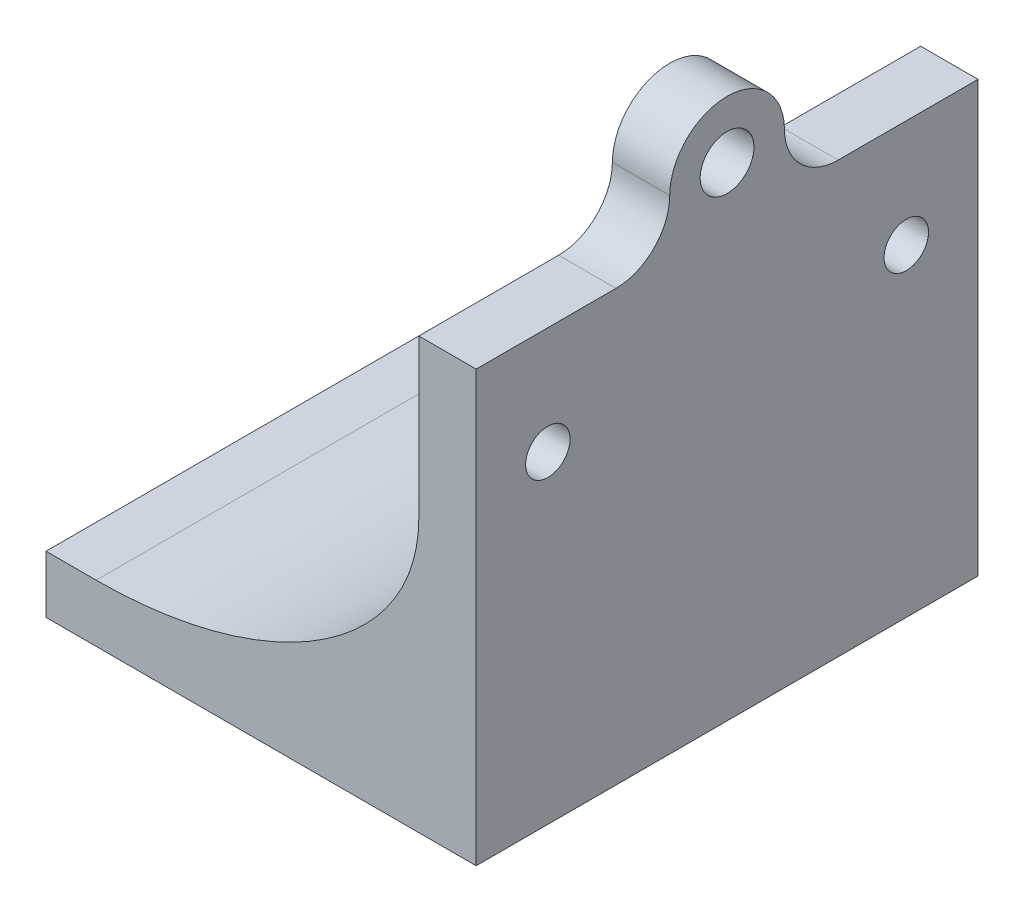
ISO-10303-21;
HEADER;
FILE_DESCRIPTION(('STEP AP214'),'2;1');
FILE_NAME('part.step','',(''),(''),'','','');
FILE_SCHEMA(('AUTOMOTIVE_DESIGN { 1 0 10303 214 1 1 1 1 }'));
ENDSEC;
DATA;
#1=APPLICATION_CONTEXT('core data for automotive mechanical design processes');
#2=APPLICATION_PROTOCOL_DEFINITION('international standard','automotive_design',2000,#1);
#3=PRODUCT_CONTEXT('',#1,'mechanical');
#4=PRODUCT('Part','Part','',(#3));
#5=PRODUCT_RELATED_PRODUCT_CATEGORY('part','',(#4));
#6=PRODUCT_DEFINITION_FORMATION('','',#4);
#7=PRODUCT_DEFINITION_CONTEXT('part definition',#1,'design');
#8=PRODUCT_DEFINITION('design','',#6,#7);
#9=PRODUCT_DEFINITION_SHAPE('','',#8);
#10=(LENGTH_UNIT() NAMED_UNIT(*) SI_UNIT(.MILLI.,.METRE.));
#11=(NAMED_UNIT(*) PLANE_ANGLE_UNIT() SI_UNIT($,.RADIAN.));
#12=(NAMED_UNIT(*) SI_UNIT($,.STERADIAN.) SOLID_ANGLE_UNIT());
#13=UNCERTAINTY_MEASURE_WITH_UNIT(LENGTH_MEASURE(1.E-05),#10,'distance_accuracy_value','');
#14=(GEOMETRIC_REPRESENTATION_CONTEXT(3) GLOBAL_UNCERTAINTY_ASSIGNED_CONTEXT((#13)) GLOBAL_UNIT_ASSIGNED_CONTEXT((#10,
#11,#12)) REPRESENTATION_CONTEXT('',''));
#15=CARTESIAN_POINT('',(0.,0.,0.));
#16=DIRECTION('',(0.,0.,1.));
#17=DIRECTION('',(1.,0.,0.));
#18=AXIS2_PLACEMENT_3D('',#15,#16,#17);
#19=CARTESIAN_POINT('',(0.,60.,70.));
#20=DIRECTION('',(0.,-1.,0.));
#21=DIRECTION('',(0.,0.,-1.));
#22=AXIS2_PLACEMENT_3D('',#19,#20,#21);
#23=PLANE('',#22);
#24=DIRECTION('',(1.,0.,0.));
#25=VECTOR('',#24,1.);
#26=CARTESIAN_POINT('',(-42.6361497533813,60.,19.500083727735));
#27=LINE('',#26,#25);
#28=CARTESIAN_POINT('',(-8.,60.,19.500083727735));
#29=VERTEX_POINT('',#28);
#30=CARTESIAN_POINT('',(0.,60.,19.500083727735));
#31=VERTEX_POINT('',#30);
#32=EDGE_CURVE('E66',#29,#31,#27,.T.);
#33=ORIENTED_EDGE('',*,*,#32,.T.);
#34=DIRECTION('',(0.,0.,-1.));
#35=VECTOR('',#34,1.);
#36=CARTESIAN_POINT('',(0.,60.,70.));
#37=LINE('',#36,#35);
#38=CARTESIAN_POINT('',(0.,60.,0.));
#39=VERTEX_POINT('',#38);
#40=EDGE_CURVE('E160',#31,#39,#37,.T.);
#41=ORIENTED_EDGE('',*,*,#40,.T.);
#42=DIRECTION('',(-1.,0.,0.));
#43=VECTOR('',#42,1.);
#44=CARTESIAN_POINT('',(0.,60.,0.));
#45=LINE('',#44,#43);
#46=CARTESIAN_POINT('',(-8.,60.,0.));
#47=VERTEX_POINT('',#46);
#48=EDGE_CURVE('E272',#39,#47,#45,.T.);
#49=ORIENTED_EDGE('',*,*,#48,.T.);
#50=DIRECTION('',(0.,0.,-1.));
#51=VECTOR('',#50,1.);
#52=CARTESIAN_POINT('',(-8.,60.,70.));
#53=LINE('',#52,#51);
#54=EDGE_CURVE('E317',#29,#47,#53,.T.);
#55=ORIENTED_EDGE('',*,*,#54,.F.);
#56=EDGE_LOOP('',(#33,#41,#49,#55));
#57=FACE_BOUND('',#56,.T.);
#58=ADVANCED_FACE('F44',(#57),#23,.F.);
#59=CARTESIAN_POINT('',(-60.,0.,70.));
#60=DIRECTION('',(0.,1.,0.));
#61=DIRECTION('',(0.,0.,1.));
#62=AXIS2_PLACEMENT_3D('',#59,#60,#61);
#63=PLANE('',#62);
#64=DIRECTION('',(1.,0.,0.));
#65=VECTOR('',#64,1.);
#66=CARTESIAN_POINT('',(-60.,0.,0.));
#67=LINE('',#66,#65);
#68=CARTESIAN_POINT('',(-60.,0.,0.));
#69=VERTEX_POINT('',#68);
#70=CARTESIAN_POINT('',(0.,0.,0.));
#71=VERTEX_POINT('',#70);
#72=EDGE_CURVE('E194',#69,#71,#67,.T.);
#73=ORIENTED_EDGE('',*,*,#72,.T.);
#74=DIRECTION('',(0.,0.,-1.));
#75=VECTOR('',#74,1.);
#76=CARTESIAN_POINT('',(0.,0.,70.));
#77=LINE('',#76,#75);
#78=CARTESIAN_POINT('',(0.,0.,70.));
#79=VERTEX_POINT('',#78);
#80=EDGE_CURVE('E263',#79,#71,#77,.T.);
#81=ORIENTED_EDGE('',*,*,#80,.F.);
#82=DIRECTION('',(1.,0.,0.));
#83=VECTOR('',#82,1.);
#84=CARTESIAN_POINT('',(-60.,0.,70.));
#85=LINE('',#84,#83);
#86=CARTESIAN_POINT('',(-60.,0.,70.));
#87=VERTEX_POINT('',#86);
#88=EDGE_CURVE('E201',#87,#79,#85,.T.);
#89=ORIENTED_EDGE('',*,*,#88,.F.);
#90=DIRECTION('',(0.,0.,-1.));
#91=VECTOR('',#90,1.);
#92=CARTESIAN_POINT('',(-60.,0.,70.));
#93=LINE('',#92,#91);
#94=EDGE_CURVE('E265',#87,#69,#93,.T.);
#95=ORIENTED_EDGE('',*,*,#94,.T.);
#96=EDGE_LOOP('',(#73,#81,#89,#95));
#97=FACE_BOUND('',#96,.T.);
#98=ADVANCED_FACE('F249',(#97),#63,.F.);
#99=CARTESIAN_POINT('',(0.,0.,70.));
#100=DIRECTION('',(-1.,0.,0.));
#101=DIRECTION('',(0.,0.,1.));
#102=AXIS2_PLACEMENT_3D('',#99,#100,#101);
#103=PLANE('',#102);
#104=CARTESIAN_POINT('',(0.,45.,60.));
#105=DIRECTION('',(1.,0.,0.));
#106=DIRECTION('',(0.,0.,-1.));
#107=AXIS2_PLACEMENT_3D('',#104,#105,#106);
#108=CIRCLE('',#107,3.09999999999999);
#109=CARTESIAN_POINT('',(0.,45.,56.9));
#110=VERTEX_POINT('',#109);
#111=EDGE_CURVE('E185',#110,#110,#108,.T.);
#112=ORIENTED_EDGE('',*,*,#111,.F.);
#113=EDGE_LOOP('',(#112));
#114=FACE_BOUND('',#113,.T.);
#115=CARTESIAN_POINT('',(0.,45.,9.99999999999999));
#116=DIRECTION('',(1.,0.,0.));
#117=DIRECTION('',(0.,0.,-1.));
#118=AXIS2_PLACEMENT_3D('',#115,#116,#117);
#119=CIRCLE('',#118,3.1);
#120=CARTESIAN_POINT('',(0.,45.,6.9));
#121=VERTEX_POINT('',#120);
#122=EDGE_CURVE('E183',#121,#121,#119,.T.);
#123=ORIENTED_EDGE('',*,*,#122,.F.);
#124=EDGE_LOOP('',(#123));
#125=FACE_BOUND('',#124,.T.);
#126=DIRECTION('',(0.,1.,0.));
#127=VECTOR('',#126,1.);
#128=CARTESIAN_POINT('',(0.,0.,0.));
#129=LINE('',#128,#127);
#130=EDGE_CURVE('E269',#71,#39,#129,.T.);
#131=ORIENTED_EDGE('',*,*,#130,.T.);
#132=ORIENTED_EDGE('',*,*,#40,.F.);
#133=CARTESIAN_POINT('',(0.,67.5,19.500083727735));
#134=DIRECTION('',(-1.,0.,0.));
#135=DIRECTION('',(0.,0.,-1.));
#136=AXIS2_PLACEMENT_3D('',#133,#134,#135);
#137=CIRCLE('',#136,7.50000000000001);
#138=CARTESIAN_POINT('',(0.,67.4753484349164,27.0000432143148));
#139=VERTEX_POINT('',#138);
#140=EDGE_CURVE('E139',#31,#139,#137,.T.);
#141=ORIENTED_EDGE('',*,*,#140,.T.);
#142=CARTESIAN_POINT('',(0.,67.4490534321606,35.));
#143=DIRECTION('',(1.,0.,0.));
#144=DIRECTION('',(0.,0.,-1.));
#145=AXIS2_PLACEMENT_3D('',#142,#143,#144);
#146=CIRCLE('',#145,8.);
#147=CARTESIAN_POINT('',(0.,67.4753484349164,42.9999567856852));
#148=VERTEX_POINT('',#147);
#149=EDGE_CURVE('E148',#139,#148,#146,.T.);
#150=ORIENTED_EDGE('',*,*,#149,.T.);
#151=CARTESIAN_POINT('',(0.,67.5,50.499916272265));
#152=DIRECTION('',(-1.,0.,0.));
#153=DIRECTION('',(0.,0.,-1.));
#154=AXIS2_PLACEMENT_3D('',#151,#152,#153);
#155=CIRCLE('',#154,7.50000000000001);
#156=CARTESIAN_POINT('',(0.,60.,50.499916272265));
#157=VERTEX_POINT('',#156);
#158=EDGE_CURVE('E145',#148,#157,#155,.T.);
#159=ORIENTED_EDGE('',*,*,#158,.T.);
#160=CARTESIAN_POINT('',(0.,60.,70.));
#161=VERTEX_POINT('',#160);
#162=EDGE_CURVE('E514',#161,#157,#37,.T.);
#163=ORIENTED_EDGE('',*,*,#162,.F.);
#164=DIRECTION('',(0.,1.,0.));
#165=VECTOR('',#164,1.);
#166=CARTESIAN_POINT('',(0.,0.,70.));
#167=LINE('',#166,#165);
#168=EDGE_CURVE('E205',#79,#161,#167,.T.);
#169=ORIENTED_EDGE('',*,*,#168,.F.);
#170=ORIENTED_EDGE('',*,*,#80,.T.);
#171=EDGE_LOOP('',(#131,#132,#141,#150,#159,#163,#169,#170));
#172=FACE_BOUND('',#171,.T.);
#173=CARTESIAN_POINT('',(0.,67.4490534321606,35.));
#174=DIRECTION('',(1.,0.,0.));
#175=DIRECTION('',(0.,0.,-1.));
#176=AXIS2_PLACEMENT_3D('',#173,#174,#175);
#177=CIRCLE('',#176,3.75000000000001);
#178=CARTESIAN_POINT('',(0.,67.4490534321606,31.25));
#179=VERTEX_POINT('',#178);
#180=EDGE_CURVE('E162',#179,#179,#177,.T.);
#181=ORIENTED_EDGE('',*,*,#180,.F.);
#182=EDGE_LOOP('',(#181));
#183=FACE_BOUND('',#182,.T.);
#184=ADVANCED_FACE('F158',(#114,#125,#172,#183),#103,.F.);
#185=ORIENTED_EDGE('',*,*,#162,.T.);
#186=DIRECTION('',(1.,0.,0.));
#187=VECTOR('',#186,1.);
#188=CARTESIAN_POINT('',(-42.6361497533813,60.,50.499916272265));
#189=LINE('',#188,#187);
#190=CARTESIAN_POINT('',(-8.,60.,50.499916272265));
#191=VERTEX_POINT('',#190);
#192=EDGE_CURVE('E174',#191,#157,#189,.T.);
#193=ORIENTED_EDGE('',*,*,#192,.F.);
#194=CARTESIAN_POINT('',(-8.,60.,70.));
#195=VERTEX_POINT('',#194);
#196=EDGE_CURVE('E512',#195,#191,#53,.T.);
#197=ORIENTED_EDGE('',*,*,#196,.F.);
#198=DIRECTION('',(-1.,0.,0.));
#199=VECTOR('',#198,1.);
#200=CARTESIAN_POINT('',(0.,60.,70.));
#201=LINE('',#200,#199);
#202=EDGE_CURVE('E209',#161,#195,#201,.T.);
#203=ORIENTED_EDGE('',*,*,#202,.F.);
#204=EDGE_LOOP('',(#185,#193,#197,#203));
#205=FACE_BOUND('',#204,.T.);
#206=ADVANCED_FACE('F241',(#205),#23,.F.);
#207=CARTESIAN_POINT('',(-8.,60.,70.));
#208=DIRECTION('',(1.,0.,0.));
#209=DIRECTION('',(0.,1.,0.));
#210=AXIS2_PLACEMENT_3D('',#207,#208,#209);
#211=PLANE('',#210);
#212=CARTESIAN_POINT('',(-8.,45.,60.));
#213=DIRECTION('',(1.,0.,0.));
#214=DIRECTION('',(0.,1.,0.));
#215=AXIS2_PLACEMENT_3D('',#212,#213,#214);
#216=CIRCLE('',#215,3.09999999999999);
#217=CARTESIAN_POINT('',(-8.,48.1,60.));
#218=VERTEX_POINT('',#217);
#219=EDGE_CURVE('E189',#218,#218,#216,.F.);
#220=ORIENTED_EDGE('',*,*,#219,.F.);
#221=EDGE_LOOP('',(#220));
#222=FACE_BOUND('',#221,.T.);
#223=CARTESIAN_POINT('',(-8.,45.,9.99999999999999));
#224=DIRECTION('',(1.,0.,0.));
#225=DIRECTION('',(0.,1.,0.));
#226=AXIS2_PLACEMENT_3D('',#223,#224,#225);
#227=CIRCLE('',#226,3.1);
#228=CARTESIAN_POINT('',(-8.,48.1,9.99999999999999));
#229=VERTEX_POINT('',#228);
#230=EDGE_CURVE('E190',#229,#229,#227,.F.);
#231=ORIENTED_EDGE('',*,*,#230,.F.);
#232=EDGE_LOOP('',(#231));
#233=FACE_BOUND('',#232,.T.);
#234=DIRECTION('',(0.,-1.,0.));
#235=VECTOR('',#234,1.);
#236=CARTESIAN_POINT('',(-8.,60.,0.));
#237=LINE('',#236,#235);
#238=CARTESIAN_POINT('',(-8.,38.,0.));
#239=VERTEX_POINT('',#238);
#240=EDGE_CURVE('E221',#47,#239,#237,.T.);
#241=ORIENTED_EDGE('',*,*,#240,.T.);
#242=CARTESIAN_POINT('',(-7.99999999999999,38.,73.5));
#243=CARTESIAN_POINT('',(-7.99999999999999,38.,47.8333333333333));
#244=CARTESIAN_POINT('',(-7.99999999999999,38.,22.1666666666666));
#245=CARTESIAN_POINT('',(-7.99999999999999,38.,-3.5));
#246=(BOUNDED_CURVE() B_SPLINE_CURVE(3,(#242,#243,#244,#245),.UNSPECIFIED.,.F.,
.F.) B_SPLINE_CURVE_WITH_KNOTS((4,4),(-0.0735,0.0035),
.UNSPECIFIED.) CURVE() GEOMETRIC_REPRESENTATION_ITEM() RATIONAL_B_SPLINE_CURVE((1.,1.,1.,1.)) REPRESENTATION_ITEM(''));
#247=CARTESIAN_POINT('',(-8.,38.,70.));
#248=VERTEX_POINT('',#247);
#249=EDGE_CURVE('E74',#239,#248,#246,.F.);
#250=ORIENTED_EDGE('',*,*,#249,.T.);
#251=DIRECTION('',(0.,-1.,0.));
#252=VECTOR('',#251,1.);
#253=CARTESIAN_POINT('',(-8.,60.,70.));
#254=LINE('',#253,#252);
#255=EDGE_CURVE('E212',#195,#248,#254,.T.);
#256=ORIENTED_EDGE('',*,*,#255,.F.);
#257=ORIENTED_EDGE('',*,*,#196,.T.);
#258=CARTESIAN_POINT('',(-8.,67.5,50.499916272265));
#259=DIRECTION('',(1.,0.,0.));
#260=DIRECTION('',(0.,1.,0.));
#261=AXIS2_PLACEMENT_3D('',#258,#259,#260);
#262=CIRCLE('',#261,7.50000000000001);
#263=CARTESIAN_POINT('',(-8.,67.4753484349164,42.9999567856852));
#264=VERTEX_POINT('',#263);
#265=EDGE_CURVE('E173',#191,#264,#262,.T.);
#266=ORIENTED_EDGE('',*,*,#265,.T.);
#267=CARTESIAN_POINT('',(-8.,67.4490534321606,35.));
#268=DIRECTION('',(1.,0.,0.));
#269=DIRECTION('',(0.,1.,0.));
#270=AXIS2_PLACEMENT_3D('',#267,#268,#269);
#271=CIRCLE('',#270,8.);
#272=CARTESIAN_POINT('',(-8.,67.4753484349164,27.0000432143148));
#273=VERTEX_POINT('',#272);
#274=EDGE_CURVE('E184',#264,#273,#271,.F.);
#275=ORIENTED_EDGE('',*,*,#274,.T.);
#276=CARTESIAN_POINT('',(-8.,67.5,19.500083727735));
#277=DIRECTION('',(1.,0.,0.));
#278=DIRECTION('',(0.,1.,0.));
#279=AXIS2_PLACEMENT_3D('',#276,#277,#278);
#280=CIRCLE('',#279,7.50000000000001);
#281=EDGE_CURVE('E140',#273,#29,#280,.T.);
#282=ORIENTED_EDGE('',*,*,#281,.T.);
#283=ORIENTED_EDGE('',*,*,#54,.T.);
#284=EDGE_LOOP('',(#241,#250,#256,#257,#266,#275,#282,#283));
#285=FACE_BOUND('',#284,.T.);
#286=CARTESIAN_POINT('',(-8.,67.4490534321606,35.));
#287=DIRECTION('',(1.,0.,0.));
#288=DIRECTION('',(0.,1.,0.));
#289=AXIS2_PLACEMENT_3D('',#286,#287,#288);
#290=CIRCLE('',#289,3.75000000000001);
#291=CARTESIAN_POINT('',(-8.,71.1990534321606,35.));
#292=VERTEX_POINT('',#291);
#293=EDGE_CURVE('E179',#292,#292,#290,.F.);
#294=ORIENTED_EDGE('',*,*,#293,.F.);
#295=EDGE_LOOP('',(#294));
#296=FACE_BOUND('',#295,.T.);
#297=ADVANCED_FACE('F230',(#222,#233,#285,#296),#211,.F.);
#298=CARTESIAN_POINT('',(-7.99999999999999,8.,70.));
#299=DIRECTION('',(0.,-1.,0.));
#300=DIRECTION('',(1.,0.,0.));
#301=AXIS2_PLACEMENT_3D('',#298,#299,#300);
#302=PLANE('',#301);
#303=DIRECTION('',(-1.,0.,0.));
#304=VECTOR('',#303,1.);
#305=CARTESIAN_POINT('',(-7.99999999999999,8.,70.));
#306=LINE('',#305,#304);
#307=CARTESIAN_POINT('',(-53.,7.99999999999999,70.));
#308=VERTEX_POINT('',#307);
#309=CARTESIAN_POINT('',(-60.,7.99999999999999,70.));
#310=VERTEX_POINT('',#309);
#311=EDGE_CURVE('E220',#308,#310,#306,.T.);
#312=ORIENTED_EDGE('',*,*,#311,.F.);
#313=CARTESIAN_POINT('',(-53.,7.99999999999999,-3.5));
#314=CARTESIAN_POINT('',(-53.,7.99999999999999,22.1666666666666));
#315=CARTESIAN_POINT('',(-53.,7.99999999999999,47.8333333333333));
#316=CARTESIAN_POINT('',(-53.,7.99999999999999,73.5));
#317=(BOUNDED_CURVE() B_SPLINE_CURVE(3,(#313,#314,#315,#316),.UNSPECIFIED.,.F.,
.F.) B_SPLINE_CURVE_WITH_KNOTS((4,4),(-0.0735,0.0035),
.UNSPECIFIED.) CURVE() GEOMETRIC_REPRESENTATION_ITEM() RATIONAL_B_SPLINE_CURVE((1.,1.,1.,1.)) REPRESENTATION_ITEM(''));
#318=CARTESIAN_POINT('',(-53.,7.99999999999999,0.));
#319=VERTEX_POINT('',#318);
#320=EDGE_CURVE('E295',#308,#319,#317,.F.);
#321=ORIENTED_EDGE('',*,*,#320,.T.);
#322=DIRECTION('',(-1.,0.,0.));
#323=VECTOR('',#322,1.);
#324=CARTESIAN_POINT('',(-7.99999999999999,8.,0.));
#325=LINE('',#324,#323);
#326=CARTESIAN_POINT('',(-60.,7.99999999999999,0.));
#327=VERTEX_POINT('',#326);
#328=EDGE_CURVE('E284',#319,#327,#325,.T.);
#329=ORIENTED_EDGE('',*,*,#328,.T.);
#330=DIRECTION('',(0.,0.,-1.));
#331=VECTOR('',#330,1.);
#332=CARTESIAN_POINT('',(-60.,7.99999999999999,70.));
#333=LINE('',#332,#331);
#334=EDGE_CURVE('E519',#310,#327,#333,.T.);
#335=ORIENTED_EDGE('',*,*,#334,.F.);
#336=EDGE_LOOP('',(#312,#321,#329,#335));
#337=FACE_BOUND('',#336,.T.);
#338=ADVANCED_FACE('F240',(#337),#302,.F.);
#339=CARTESIAN_POINT('',(-60.,7.99999999999999,70.));
#340=DIRECTION('',(1.,0.,0.));
#341=DIRECTION('',(0.,0.,-1.));
#342=AXIS2_PLACEMENT_3D('',#339,#340,#341);
#343=PLANE('',#342);
#344=DIRECTION('',(0.,-1.,0.));
#345=VECTOR('',#344,1.);
#346=CARTESIAN_POINT('',(-60.,7.99999999999999,0.));
#347=LINE('',#346,#345);
#348=EDGE_CURVE('E206',#327,#69,#347,.T.);
#349=ORIENTED_EDGE('',*,*,#348,.T.);
#350=ORIENTED_EDGE('',*,*,#94,.F.);
#351=DIRECTION('',(0.,-1.,0.));
#352=VECTOR('',#351,1.);
#353=CARTESIAN_POINT('',(-60.,7.99999999999999,70.));
#354=LINE('',#353,#352);
#355=EDGE_CURVE('E274',#310,#87,#354,.T.);
#356=ORIENTED_EDGE('',*,*,#355,.F.);
#357=ORIENTED_EDGE('',*,*,#334,.T.);
#358=EDGE_LOOP('',(#349,#350,#356,#357));
#359=FACE_BOUND('',#358,.T.);
#360=ADVANCED_FACE('F361',(#359),#343,.F.);
#361=CARTESIAN_POINT('',(0.,0.,70.));
#362=DIRECTION('',(0.,0.,1.));
#363=DIRECTION('',(1.,0.,0.));
#364=AXIS2_PLACEMENT_3D('',#361,#362,#363);
#365=PLANE('',#364);
#366=ORIENTED_EDGE('',*,*,#88,.T.);
#367=ORIENTED_EDGE('',*,*,#168,.T.);
#368=ORIENTED_EDGE('',*,*,#202,.T.);
#369=ORIENTED_EDGE('',*,*,#255,.T.);
#370=CARTESIAN_POINT('',(-53.,7.99999999999999,70.));
#371=CARTESIAN_POINT('',(-7.99999999999999,8.,70.));
#372=CARTESIAN_POINT('',(-7.99999999999999,38.,70.));
#373=(BOUNDED_CURVE() B_SPLINE_CURVE(2,(#370,#371,#372),.UNSPECIFIED.,.F.,
.F.) B_SPLINE_CURVE_WITH_KNOTS((3,3),(0.,1.),
.UNSPECIFIED.) CURVE() GEOMETRIC_REPRESENTATION_ITEM() RATIONAL_B_SPLINE_CURVE((1.,
0.707106781186548,1.)) REPRESENTATION_ITEM(''));
#374=EDGE_CURVE('E12',#248,#308,#373,.F.);
#375=ORIENTED_EDGE('',*,*,#374,.T.);
#376=ORIENTED_EDGE('',*,*,#311,.T.);
#377=ORIENTED_EDGE('',*,*,#355,.T.);
#378=EDGE_LOOP('',(#366,#367,#368,#369,#375,#376,#377));
#379=FACE_BOUND('',#378,.T.);
#380=ADVANCED_FACE('F351',(#379),#365,.T.);
#381=CARTESIAN_POINT('',(0.,0.,0.));
#382=DIRECTION('',(0.,0.,1.));
#383=DIRECTION('',(1.,0.,0.));
#384=AXIS2_PLACEMENT_3D('',#381,#382,#383);
#385=PLANE('',#384);
#386=ORIENTED_EDGE('',*,*,#72,.F.);
#387=ORIENTED_EDGE('',*,*,#348,.F.);
#388=ORIENTED_EDGE('',*,*,#328,.F.);
#389=CARTESIAN_POINT('',(-7.99999999999999,38.,0.));
#390=CARTESIAN_POINT('',(-7.99999999999998,8.,0.));
#391=CARTESIAN_POINT('',(-53.,7.99999999999999,0.));
#392=(BOUNDED_CURVE() B_SPLINE_CURVE(2,(#389,#390,#391),.UNSPECIFIED.,.F.,
.F.) B_SPLINE_CURVE_WITH_KNOTS((3,3),(0.,1.),
.UNSPECIFIED.) CURVE() GEOMETRIC_REPRESENTATION_ITEM() RATIONAL_B_SPLINE_CURVE((1.,
0.707106781186548,1.)) REPRESENTATION_ITEM(''));
#393=EDGE_CURVE('E59',#319,#239,#392,.F.);
#394=ORIENTED_EDGE('',*,*,#393,.T.);
#395=ORIENTED_EDGE('',*,*,#240,.F.);
#396=ORIENTED_EDGE('',*,*,#48,.F.);
#397=ORIENTED_EDGE('',*,*,#130,.F.);
#398=EDGE_LOOP('',(#386,#387,#388,#394,#395,#396,#397));
#399=FACE_BOUND('',#398,.T.);
#400=ADVANCED_FACE('F310',(#399),#385,.F.);
#401=CARTESIAN_POINT('',(-60.001,45.,9.99999999999999));
#402=DIRECTION('',(1.,0.,0.));
#403=DIRECTION('',(0.,0.,-1.));
#404=AXIS2_PLACEMENT_3D('',#401,#402,#403);
#405=CYLINDRICAL_SURFACE('',#404,3.1);
#406=ORIENTED_EDGE('',*,*,#122,.T.);
#407=EDGE_LOOP('',(#406));
#408=FACE_BOUND('',#407,.T.);
#409=ORIENTED_EDGE('',*,*,#230,.T.);
#410=EDGE_LOOP('',(#409));
#411=FACE_BOUND('',#410,.T.);
#412=ADVANCED_FACE('F363',(#408,#411),#405,.F.);
#413=CARTESIAN_POINT('',(-60.001,45.,60.));
#414=DIRECTION('',(1.,0.,0.));
#415=DIRECTION('',(0.,0.,-1.));
#416=AXIS2_PLACEMENT_3D('',#413,#414,#415);
#417=CYLINDRICAL_SURFACE('',#416,3.09999999999999);
#418=ORIENTED_EDGE('',*,*,#111,.T.);
#419=EDGE_LOOP('',(#418));
#420=FACE_BOUND('',#419,.T.);
#421=ORIENTED_EDGE('',*,*,#219,.T.);
#422=EDGE_LOOP('',(#421));
#423=FACE_BOUND('',#422,.T.);
#424=ADVANCED_FACE('F411',(#420,#423),#417,.F.);
#425=CARTESIAN_POINT('',(-7.99999999999999,38.,-3.5));
#426=CARTESIAN_POINT('',(-7.99999999999999,38.,22.1666666666666));
#427=CARTESIAN_POINT('',(-7.99999999999999,38.,47.8333333333333));
#428=CARTESIAN_POINT('',(-7.99999999999999,38.,73.5));
#429=CARTESIAN_POINT('',(-7.99999999999999,8.,-3.5));
#430=CARTESIAN_POINT('',(-7.99999999999999,8.,22.1666666666666));
#431=CARTESIAN_POINT('',(-7.99999999999999,8.,47.8333333333334));
#432=CARTESIAN_POINT('',(-7.99999999999999,8.,73.5));
#433=CARTESIAN_POINT('',(-53.,7.99999999999999,-3.5));
#434=CARTESIAN_POINT('',(-53.,7.99999999999999,22.1666666666666));
#435=CARTESIAN_POINT('',(-53.,7.99999999999999,47.8333333333333));
#436=CARTESIAN_POINT('',(-53.,7.99999999999999,73.5));
#437=(BOUNDED_SURFACE() B_SPLINE_SURFACE(2,3,((#425,#426,#427,#428),(#429,#430,#431,#432),(#433,
#434,#435,#436)),.UNSPECIFIED.,.F.,.F.,.F.) B_SPLINE_SURFACE_WITH_KNOTS((3,3),(4,4),(0.,1.),
(-0.0735,0.0035),.UNSPECIFIED.) GEOMETRIC_REPRESENTATION_ITEM() RATIONAL_B_SPLINE_SURFACE(((1.,
1.,1.,1.),(0.707106781186548,0.707106781186548,0.707106781186548,0.707106781186548),(1.,1.,1.,1.))) REPRESENTATION_ITEM('') SURFACE());
#438=ORIENTED_EDGE('',*,*,#374,.F.);
#439=ORIENTED_EDGE('',*,*,#249,.F.);
#440=ORIENTED_EDGE('',*,*,#393,.F.);
#441=ORIENTED_EDGE('',*,*,#320,.F.);
#442=EDGE_LOOP('',(#438,#439,#440,#441));
#443=FACE_BOUND('',#442,.T.);
#444=ADVANCED_FACE('F47',(#443),#437,.T.);
#445=CARTESIAN_POINT('',(-42.6361497533813,67.4490534321606,35.));
#446=DIRECTION('',(1.,0.,0.));
#447=DIRECTION('',(0.,0.,-1.));
#448=AXIS2_PLACEMENT_3D('',#445,#446,#447);
#449=CYLINDRICAL_SURFACE('',#448,8.);
#450=ORIENTED_EDGE('',*,*,#274,.F.);
#451=DIRECTION('',(1.,0.,0.));
#452=VECTOR('',#451,1.);
#453=CARTESIAN_POINT('',(-42.6361497533813,67.4753484349164,42.9999567856852));
#454=LINE('',#453,#452);
#455=EDGE_CURVE('E144',#264,#148,#454,.T.);
#456=ORIENTED_EDGE('',*,*,#455,.T.);
#457=ORIENTED_EDGE('',*,*,#149,.F.);
#458=DIRECTION('',(1.,0.,0.));
#459=VECTOR('',#458,1.);
#460=CARTESIAN_POINT('',(-42.6361497533813,67.4753484349164,27.0000432143148));
#461=LINE('',#460,#459);
#462=EDGE_CURVE('E135',#273,#139,#461,.T.);
#463=ORIENTED_EDGE('',*,*,#462,.F.);
#464=EDGE_LOOP('',(#450,#456,#457,#463));
#465=FACE_BOUND('',#464,.T.);
#466=ADVANCED_FACE('F149',(#465),#449,.T.);
#467=CARTESIAN_POINT('',(-42.6361497533813,67.5,50.499916272265));
#468=DIRECTION('',(1.,0.,0.));
#469=DIRECTION('',(0.,0.,-1.));
#470=AXIS2_PLACEMENT_3D('',#467,#468,#469);
#471=CYLINDRICAL_SURFACE('',#470,7.50000000000001);
#472=ORIENTED_EDGE('',*,*,#265,.F.);
#473=ORIENTED_EDGE('',*,*,#192,.T.);
#474=ORIENTED_EDGE('',*,*,#158,.F.);
#475=ORIENTED_EDGE('',*,*,#455,.F.);
#476=EDGE_LOOP('',(#472,#473,#474,#475));
#477=FACE_BOUND('',#476,.T.);
#478=ADVANCED_FACE('F454',(#477),#471,.F.);
#479=CARTESIAN_POINT('',(-42.6361497533813,67.5,19.500083727735));
#480=DIRECTION('',(1.,0.,0.));
#481=DIRECTION('',(0.,0.,-1.));
#482=AXIS2_PLACEMENT_3D('',#479,#480,#481);
#483=CYLINDRICAL_SURFACE('',#482,7.50000000000001);
#484=ORIENTED_EDGE('',*,*,#281,.F.);
#485=ORIENTED_EDGE('',*,*,#462,.T.);
#486=ORIENTED_EDGE('',*,*,#140,.F.);
#487=ORIENTED_EDGE('',*,*,#32,.F.);
#488=EDGE_LOOP('',(#484,#485,#486,#487));
#489=FACE_BOUND('',#488,.T.);
#490=ADVANCED_FACE('F137',(#489),#483,.F.);
#491=CARTESIAN_POINT('',(-42.6361497533813,67.4490534321606,35.));
#492=DIRECTION('',(1.,0.,0.));
#493=DIRECTION('',(0.,0.,-1.));
#494=AXIS2_PLACEMENT_3D('',#491,#492,#493);
#495=CYLINDRICAL_SURFACE('',#494,3.75000000000001);
#496=ORIENTED_EDGE('',*,*,#293,.T.);
#497=EDGE_LOOP('',(#496));
#498=FACE_BOUND('',#497,.T.);
#499=ORIENTED_EDGE('',*,*,#180,.T.);
#500=EDGE_LOOP('',(#499));
#501=FACE_BOUND('',#500,.T.);
#502=ADVANCED_FACE('F470',(#498,#501),#495,.F.);
#503=CLOSED_SHELL('',(#58,#98,#184,#206,#297,#338,#360,#380,#400,#412,#424,#444,#466,#478,#490,#502));
#504=MANIFOLD_SOLID_BREP('B2',#503);
#505=ADVANCED_BREP_SHAPE_REPRESENTATION('',(#18,#504),#14);
#506=SHAPE_DEFINITION_REPRESENTATION(#9,#505);
ENDSEC;
END-ISO-10303-21;
